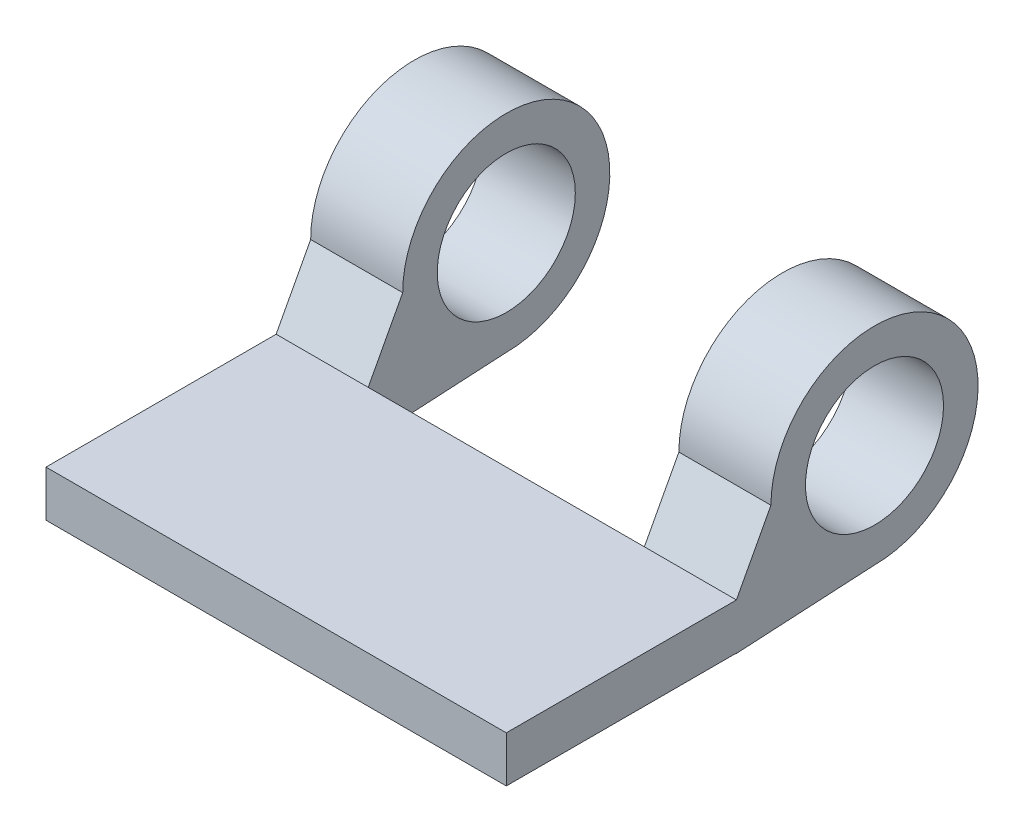
ISO-10303-21;
HEADER;
FILE_DESCRIPTION(('STEP AP214'),'2;1');
FILE_NAME('part.step','',(''),(''),'','','');
FILE_SCHEMA(('AUTOMOTIVE_DESIGN { 1 0 10303 214 1 1 1 1 }'));
ENDSEC;
DATA;
#1=APPLICATION_CONTEXT('core data for automotive mechanical design processes');
#2=APPLICATION_PROTOCOL_DEFINITION('international standard','automotive_design',2000,#1);
#3=PRODUCT_CONTEXT('',#1,'mechanical');
#4=PRODUCT('Part','Part','',(#3));
#5=PRODUCT_RELATED_PRODUCT_CATEGORY('part','',(#4));
#6=PRODUCT_DEFINITION_FORMATION('','',#4);
#7=PRODUCT_DEFINITION_CONTEXT('part definition',#1,'design');
#8=PRODUCT_DEFINITION('design','',#6,#7);
#9=PRODUCT_DEFINITION_SHAPE('','',#8);
#10=(LENGTH_UNIT() NAMED_UNIT(*) SI_UNIT(.MILLI.,.METRE.));
#11=(NAMED_UNIT(*) PLANE_ANGLE_UNIT() SI_UNIT($,.RADIAN.));
#12=(NAMED_UNIT(*) SI_UNIT($,.STERADIAN.) SOLID_ANGLE_UNIT());
#13=UNCERTAINTY_MEASURE_WITH_UNIT(LENGTH_MEASURE(1.E-05),#10,'distance_accuracy_value','');
#14=(GEOMETRIC_REPRESENTATION_CONTEXT(3) GLOBAL_UNCERTAINTY_ASSIGNED_CONTEXT((#13)) GLOBAL_UNIT_ASSIGNED_CONTEXT((#10,
#11,#12)) REPRESENTATION_CONTEXT('',''));
#15=CARTESIAN_POINT('',(0.,0.,0.));
#16=DIRECTION('',(0.,0.,1.));
#17=DIRECTION('',(1.,0.,0.));
#18=AXIS2_PLACEMENT_3D('',#15,#16,#17);
#19=CARTESIAN_POINT('',(0.,2.,0.));
#20=DIRECTION('',(0.,0.,-1.));
#21=DIRECTION('',(-1.,0.,0.));
#22=AXIS2_PLACEMENT_3D('',#19,#20,#21);
#23=PLANE('',#22);
#24=DIRECTION('',(1.,0.,0.));
#25=VECTOR('',#24,1.);
#26=CARTESIAN_POINT('',(0.,0.,0.));
#27=LINE('',#26,#25);
#28=CARTESIAN_POINT('',(-6.,0.,0.));
#29=VERTEX_POINT('',#28);
#30=CARTESIAN_POINT('',(6.,0.,0.));
#31=VERTEX_POINT('',#30);
#32=EDGE_CURVE('E71',#29,#31,#27,.T.);
#33=ORIENTED_EDGE('',*,*,#32,.F.);
#34=DIRECTION('',(0.,-1.,0.));
#35=VECTOR('',#34,1.);
#36=CARTESIAN_POINT('',(-6.,2.,0.));
#37=LINE('',#36,#35);
#38=CARTESIAN_POINT('',(-6.,2.,0.));
#39=VERTEX_POINT('',#38);
#40=EDGE_CURVE('E63',#39,#29,#37,.T.);
#41=ORIENTED_EDGE('',*,*,#40,.F.);
#42=DIRECTION('',(1.,0.,0.));
#43=VECTOR('',#42,1.);
#44=CARTESIAN_POINT('',(0.,2.,0.));
#45=LINE('',#44,#43);
#46=CARTESIAN_POINT('',(6.,2.,0.));
#47=VERTEX_POINT('',#46);
#48=EDGE_CURVE('E166',#39,#47,#45,.T.);
#49=ORIENTED_EDGE('',*,*,#48,.T.);
#50=DIRECTION('',(0.,-1.,0.));
#51=VECTOR('',#50,1.);
#52=CARTESIAN_POINT('',(6.,2.,0.));
#53=LINE('',#52,#51);
#54=EDGE_CURVE('E243',#47,#31,#53,.T.);
#55=ORIENTED_EDGE('',*,*,#54,.T.);
#56=EDGE_LOOP('',(#33,#41,#49,#55));
#57=FACE_BOUND('',#56,.T.);
#58=ADVANCED_FACE('F47',(#57),#23,.T.);
#59=CARTESIAN_POINT('',(10.,2.,0.));
#60=DIRECTION('',(1.,0.,0.));
#61=DIRECTION('',(0.,0.,-1.));
#62=AXIS2_PLACEMENT_3D('',#59,#60,#61);
#63=PLANE('',#62);
#64=DIRECTION('',(0.,0.,1.));
#65=VECTOR('',#64,1.);
#66=CARTESIAN_POINT('',(10.,0.,0.));
#67=LINE('',#66,#65);
#68=CARTESIAN_POINT('',(10.,0.,0.));
#69=VERTEX_POINT('',#68);
#70=CARTESIAN_POINT('',(10.,0.,10.));
#71=VERTEX_POINT('',#70);
#72=EDGE_CURVE('E176',#69,#71,#67,.T.);
#73=ORIENTED_EDGE('',*,*,#72,.F.);
#74=DIRECTION('',(0.,-1.,0.));
#75=VECTOR('',#74,1.);
#76=CARTESIAN_POINT('',(10.,2.,0.));
#77=LINE('',#76,#75);
#78=CARTESIAN_POINT('',(10.,-0.0140422264021949,0.));
#79=VERTEX_POINT('',#78);
#80=EDGE_CURVE('E230',#69,#79,#77,.T.);
#81=ORIENTED_EDGE('',*,*,#80,.T.);
#82=DIRECTION('',(0.,0.0546560342685006,-0.998505241807994));
#83=VECTOR('',#82,1.);
#84=CARTESIAN_POINT('',(10.,0.314384898344003,-6.00000000000005));
#85=LINE('',#84,#83);
#86=CARTESIAN_POINT('',(10.,0.314384898344003,-6.00000000000005));
#87=VERTEX_POINT('',#86);
#88=EDGE_CURVE('E227',#79,#87,#85,.T.);
#89=ORIENTED_EDGE('',*,*,#88,.T.);
#90=CARTESIAN_POINT('',(10.,4.814384898344,-6.));
#91=DIRECTION('',(1.,0.,0.));
#92=DIRECTION('',(0.,0.,-1.));
#93=AXIS2_PLACEMENT_3D('',#90,#91,#92);
#94=CIRCLE('',#93,4.49999999999999);
#95=CARTESIAN_POINT('',(10.,4.814384898344,-1.5));
#96=VERTEX_POINT('',#95);
#97=EDGE_CURVE('E224',#87,#96,#94,.T.);
#98=ORIENTED_EDGE('',*,*,#97,.T.);
#99=DIRECTION('',(0.,-0.882483793082707,0.470342805777188));
#100=VECTOR('',#99,1.);
#101=CARTESIAN_POINT('',(10.,2.,0.));
#102=LINE('',#101,#100);
#103=CARTESIAN_POINT('',(10.,2.,0.));
#104=VERTEX_POINT('',#103);
#105=EDGE_CURVE('E221',#96,#104,#102,.T.);
#106=ORIENTED_EDGE('',*,*,#105,.T.);
#107=DIRECTION('',(0.,0.,1.));
#108=VECTOR('',#107,1.);
#109=CARTESIAN_POINT('',(10.,2.,0.));
#110=LINE('',#109,#108);
#111=CARTESIAN_POINT('',(10.,2.,10.));
#112=VERTEX_POINT('',#111);
#113=EDGE_CURVE('E170',#104,#112,#110,.T.);
#114=ORIENTED_EDGE('',*,*,#113,.T.);
#115=DIRECTION('',(0.,-1.,0.));
#116=VECTOR('',#115,1.);
#117=CARTESIAN_POINT('',(10.,2.,10.));
#118=LINE('',#117,#116);
#119=EDGE_CURVE('E56',#112,#71,#118,.T.);
#120=ORIENTED_EDGE('',*,*,#119,.T.);
#121=EDGE_LOOP('',(#73,#81,#89,#98,#106,#114,#120));
#122=FACE_BOUND('',#121,.T.);
#123=CARTESIAN_POINT('',(10.,4.814384898344,-6.));
#124=DIRECTION('',(1.,0.,0.));
#125=DIRECTION('',(0.,0.,-1.));
#126=AXIS2_PLACEMENT_3D('',#123,#124,#125);
#127=CIRCLE('',#126,2.99999999999999);
#128=CARTESIAN_POINT('',(10.,4.814384898344,-8.99999999999999));
#129=VERTEX_POINT('',#128);
#130=EDGE_CURVE('E249',#129,#129,#127,.T.);
#131=ORIENTED_EDGE('',*,*,#130,.F.);
#132=EDGE_LOOP('',(#131));
#133=FACE_BOUND('',#132,.T.);
#134=ADVANCED_FACE('F49',(#122,#133),#63,.T.);
#135=CARTESIAN_POINT('',(-10.,2.,0.));
#136=DIRECTION('',(1.,0.,0.));
#137=DIRECTION('',(0.,0.,-1.));
#138=AXIS2_PLACEMENT_3D('',#135,#136,#137);
#139=PLANE('',#138);
#140=DIRECTION('',(0.,0.,1.));
#141=VECTOR('',#140,1.);
#142=CARTESIAN_POINT('',(-10.,0.,0.));
#143=LINE('',#142,#141);
#144=CARTESIAN_POINT('',(-10.,0.,0.));
#145=VERTEX_POINT('',#144);
#146=CARTESIAN_POINT('',(-10.,0.,10.));
#147=VERTEX_POINT('',#146);
#148=EDGE_CURVE('E185',#145,#147,#143,.T.);
#149=ORIENTED_EDGE('',*,*,#148,.T.);
#150=DIRECTION('',(0.,-1.,0.));
#151=VECTOR('',#150,1.);
#152=CARTESIAN_POINT('',(-10.,2.,10.));
#153=LINE('',#152,#151);
#154=CARTESIAN_POINT('',(-10.,2.,10.));
#155=VERTEX_POINT('',#154);
#156=EDGE_CURVE('E11',#155,#147,#153,.T.);
#157=ORIENTED_EDGE('',*,*,#156,.F.);
#158=DIRECTION('',(0.,0.,1.));
#159=VECTOR('',#158,1.);
#160=CARTESIAN_POINT('',(-10.,2.,0.));
#161=LINE('',#160,#159);
#162=CARTESIAN_POINT('',(-10.,2.,0.));
#163=VERTEX_POINT('',#162);
#164=EDGE_CURVE('E154',#163,#155,#161,.T.);
#165=ORIENTED_EDGE('',*,*,#164,.F.);
#166=DIRECTION('',(0.,-0.882483793082707,0.470342805777188));
#167=VECTOR('',#166,1.);
#168=CARTESIAN_POINT('',(-10.,2.,0.));
#169=LINE('',#168,#167);
#170=CARTESIAN_POINT('',(-10.,4.814384898344,-1.5));
#171=VERTEX_POINT('',#170);
#172=EDGE_CURVE('E139',#171,#163,#169,.T.);
#173=ORIENTED_EDGE('',*,*,#172,.F.);
#174=CARTESIAN_POINT('',(-10.,4.814384898344,-6.));
#175=DIRECTION('',(1.,0.,0.));
#176=DIRECTION('',(0.,0.,-1.));
#177=AXIS2_PLACEMENT_3D('',#174,#175,#176);
#178=CIRCLE('',#177,4.49999999999999);
#179=CARTESIAN_POINT('',(-10.,0.314384898344003,-6.00000000000005));
#180=VERTEX_POINT('',#179);
#181=EDGE_CURVE('E150',#180,#171,#178,.T.);
#182=ORIENTED_EDGE('',*,*,#181,.F.);
#183=DIRECTION('',(0.,0.0546560342685006,-0.998505241807994));
#184=VECTOR('',#183,1.);
#185=CARTESIAN_POINT('',(-10.,0.314384898344003,-6.00000000000005));
#186=LINE('',#185,#184);
#187=CARTESIAN_POINT('',(-10.,-0.0140422264021949,0.));
#188=VERTEX_POINT('',#187);
#189=EDGE_CURVE('E265',#188,#180,#186,.T.);
#190=ORIENTED_EDGE('',*,*,#189,.F.);
#191=DIRECTION('',(0.,-1.,0.));
#192=VECTOR('',#191,1.);
#193=CARTESIAN_POINT('',(-10.,2.,0.));
#194=LINE('',#193,#192);
#195=EDGE_CURVE('E151',#145,#188,#194,.T.);
#196=ORIENTED_EDGE('',*,*,#195,.F.);
#197=EDGE_LOOP('',(#149,#157,#165,#173,#182,#190,#196));
#198=FACE_BOUND('',#197,.T.);
#199=CARTESIAN_POINT('',(-10.,4.814384898344,-6.));
#200=DIRECTION('',(1.,0.,0.));
#201=DIRECTION('',(0.,0.,-1.));
#202=AXIS2_PLACEMENT_3D('',#199,#200,#201);
#203=CIRCLE('',#202,2.99999999999999);
#204=CARTESIAN_POINT('',(-10.,4.814384898344,-8.99999999999999));
#205=VERTEX_POINT('',#204);
#206=EDGE_CURVE('E289',#205,#205,#203,.T.);
#207=ORIENTED_EDGE('',*,*,#206,.T.);
#208=EDGE_LOOP('',(#207));
#209=FACE_BOUND('',#208,.T.);
#210=ADVANCED_FACE('F155',(#198,#209),#139,.F.);
#211=CARTESIAN_POINT('',(0.,2.,10.));
#212=DIRECTION('',(0.,0.,-1.));
#213=DIRECTION('',(-1.,0.,0.));
#214=AXIS2_PLACEMENT_3D('',#211,#212,#213);
#215=PLANE('',#214);
#216=DIRECTION('',(1.,0.,0.));
#217=VECTOR('',#216,1.);
#218=CARTESIAN_POINT('',(0.,0.,10.));
#219=LINE('',#218,#217);
#220=EDGE_CURVE('E188',#147,#71,#219,.T.);
#221=ORIENTED_EDGE('',*,*,#220,.T.);
#222=ORIENTED_EDGE('',*,*,#119,.F.);
#223=DIRECTION('',(1.,0.,0.));
#224=VECTOR('',#223,1.);
#225=CARTESIAN_POINT('',(0.,2.,10.));
#226=LINE('',#225,#224);
#227=EDGE_CURVE('E160',#155,#112,#226,.T.);
#228=ORIENTED_EDGE('',*,*,#227,.F.);
#229=ORIENTED_EDGE('',*,*,#156,.T.);
#230=EDGE_LOOP('',(#221,#222,#228,#229));
#231=FACE_BOUND('',#230,.T.);
#232=ADVANCED_FACE('F199',(#231),#215,.F.);
#233=CARTESIAN_POINT('',(0.,2.,0.));
#234=DIRECTION('',(0.,1.,0.));
#235=DIRECTION('',(0.,0.,1.));
#236=AXIS2_PLACEMENT_3D('',#233,#234,#235);
#237=PLANE('',#236);
#238=ORIENTED_EDGE('',*,*,#113,.F.);
#239=DIRECTION('',(-1.,0.,0.));
#240=VECTOR('',#239,1.);
#241=CARTESIAN_POINT('',(10.,2.,0.));
#242=LINE('',#241,#240);
#243=EDGE_CURVE('E218',#104,#47,#242,.T.);
#244=ORIENTED_EDGE('',*,*,#243,.T.);
#245=ORIENTED_EDGE('',*,*,#48,.F.);
#246=EDGE_CURVE('E144',#163,#39,#45,.T.);
#247=ORIENTED_EDGE('',*,*,#246,.F.);
#248=ORIENTED_EDGE('',*,*,#164,.T.);
#249=ORIENTED_EDGE('',*,*,#227,.T.);
#250=EDGE_LOOP('',(#238,#244,#245,#247,#248,#249));
#251=FACE_BOUND('',#250,.T.);
#252=ADVANCED_FACE('F164',(#251),#237,.T.);
#253=CARTESIAN_POINT('',(0.,0.,0.));
#254=DIRECTION('',(0.,1.,0.));
#255=DIRECTION('',(0.,0.,1.));
#256=AXIS2_PLACEMENT_3D('',#253,#254,#255);
#257=PLANE('',#256);
#258=ORIENTED_EDGE('',*,*,#72,.T.);
#259=ORIENTED_EDGE('',*,*,#220,.F.);
#260=ORIENTED_EDGE('',*,*,#148,.F.);
#261=EDGE_CURVE('E182',#145,#29,#27,.T.);
#262=ORIENTED_EDGE('',*,*,#261,.T.);
#263=ORIENTED_EDGE('',*,*,#32,.T.);
#264=EDGE_CURVE('E180',#31,#69,#27,.T.);
#265=ORIENTED_EDGE('',*,*,#264,.T.);
#266=EDGE_LOOP('',(#258,#259,#260,#262,#263,#265));
#267=FACE_BOUND('',#266,.T.);
#268=ADVANCED_FACE('F201',(#267),#257,.F.);
#269=CARTESIAN_POINT('',(6.,4.814384898344,-6.));
#270=DIRECTION('',(1.,0.,0.));
#271=DIRECTION('',(0.,0.,-1.));
#272=AXIS2_PLACEMENT_3D('',#269,#270,#271);
#273=PLANE('',#272);
#274=ORIENTED_EDGE('',*,*,#54,.F.);
#275=DIRECTION('',(0.,-0.882483793082707,0.470342805777188));
#276=VECTOR('',#275,1.);
#277=CARTESIAN_POINT('',(6.,2.,0.));
#278=LINE('',#277,#276);
#279=CARTESIAN_POINT('',(6.,4.814384898344,-1.5));
#280=VERTEX_POINT('',#279);
#281=EDGE_CURVE('E233',#280,#47,#278,.T.);
#282=ORIENTED_EDGE('',*,*,#281,.F.);
#283=CARTESIAN_POINT('',(6.,4.814384898344,-6.));
#284=DIRECTION('',(1.,0.,0.));
#285=DIRECTION('',(0.,0.,-1.));
#286=AXIS2_PLACEMENT_3D('',#283,#284,#285);
#287=CIRCLE('',#286,4.49999999999999);
#288=CARTESIAN_POINT('',(6.,0.314384898344003,-6.00000000000005));
#289=VERTEX_POINT('',#288);
#290=EDGE_CURVE('E237',#289,#280,#287,.T.);
#291=ORIENTED_EDGE('',*,*,#290,.F.);
#292=DIRECTION('',(0.,0.0546560342685006,-0.998505241807994));
#293=VECTOR('',#292,1.);
#294=CARTESIAN_POINT('',(6.,0.314384898344003,-6.00000000000005));
#295=LINE('',#294,#293);
#296=CARTESIAN_POINT('',(6.,-0.0140422264021949,0.));
#297=VERTEX_POINT('',#296);
#298=EDGE_CURVE('E240',#297,#289,#295,.T.);
#299=ORIENTED_EDGE('',*,*,#298,.F.);
#300=EDGE_CURVE('E246',#31,#297,#53,.T.);
#301=ORIENTED_EDGE('',*,*,#300,.F.);
#302=EDGE_LOOP('',(#274,#282,#291,#299,#301));
#303=FACE_BOUND('',#302,.T.);
#304=CARTESIAN_POINT('',(6.,4.814384898344,-6.));
#305=DIRECTION('',(1.,0.,0.));
#306=DIRECTION('',(0.,0.,-1.));
#307=AXIS2_PLACEMENT_3D('',#304,#305,#306);
#308=CIRCLE('',#307,2.99999999999999);
#309=CARTESIAN_POINT('',(6.,4.814384898344,-8.99999999999999));
#310=VERTEX_POINT('',#309);
#311=EDGE_CURVE('E252',#310,#310,#308,.T.);
#312=ORIENTED_EDGE('',*,*,#311,.T.);
#313=EDGE_LOOP('',(#312));
#314=FACE_BOUND('',#313,.T.);
#315=ADVANCED_FACE('F326',(#303,#314),#273,.F.);
#316=CARTESIAN_POINT('',(10.,2.,0.));
#317=DIRECTION('',(0.,0.,-1.));
#318=DIRECTION('',(0.,1.,0.));
#319=AXIS2_PLACEMENT_3D('',#316,#317,#318);
#320=PLANE('',#319);
#321=ORIENTED_EDGE('',*,*,#264,.F.);
#322=ORIENTED_EDGE('',*,*,#300,.T.);
#323=DIRECTION('',(-1.,0.,0.));
#324=VECTOR('',#323,1.);
#325=CARTESIAN_POINT('',(10.,-0.0140422264021949,0.));
#326=LINE('',#325,#324);
#327=EDGE_CURVE('E181',#79,#297,#326,.T.);
#328=ORIENTED_EDGE('',*,*,#327,.F.);
#329=ORIENTED_EDGE('',*,*,#80,.F.);
#330=EDGE_LOOP('',(#321,#322,#328,#329));
#331=FACE_BOUND('',#330,.T.);
#332=ADVANCED_FACE('F329',(#331),#320,.F.);
#333=CARTESIAN_POINT('',(10.,0.314384898344003,-6.00000000000005));
#334=DIRECTION('',(0.,0.998505241807994,0.0546560342685006));
#335=DIRECTION('',(0.,-0.0546560342685006,0.998505241807994));
#336=AXIS2_PLACEMENT_3D('',#333,#334,#335);
#337=PLANE('',#336);
#338=ORIENTED_EDGE('',*,*,#298,.T.);
#339=DIRECTION('',(-1.,0.,0.));
#340=VECTOR('',#339,1.);
#341=CARTESIAN_POINT('',(10.,0.314384898344003,-6.00000000000005));
#342=LINE('',#341,#340);
#343=EDGE_CURVE('E211',#87,#289,#342,.T.);
#344=ORIENTED_EDGE('',*,*,#343,.F.);
#345=ORIENTED_EDGE('',*,*,#88,.F.);
#346=ORIENTED_EDGE('',*,*,#327,.T.);
#347=EDGE_LOOP('',(#338,#344,#345,#346));
#348=FACE_BOUND('',#347,.T.);
#349=ADVANCED_FACE('F332',(#348),#337,.F.);
#350=CARTESIAN_POINT('',(10.,4.814384898344,-6.));
#351=DIRECTION('',(-1.,0.,0.));
#352=DIRECTION('',(0.,0.,1.));
#353=AXIS2_PLACEMENT_3D('',#350,#351,#352);
#354=CYLINDRICAL_SURFACE('',#353,4.49999999999999);
#355=ORIENTED_EDGE('',*,*,#290,.T.);
#356=DIRECTION('',(-1.,0.,0.));
#357=VECTOR('',#356,1.);
#358=CARTESIAN_POINT('',(10.,4.814384898344,-1.5));
#359=LINE('',#358,#357);
#360=EDGE_CURVE('E214',#96,#280,#359,.T.);
#361=ORIENTED_EDGE('',*,*,#360,.F.);
#362=ORIENTED_EDGE('',*,*,#97,.F.);
#363=ORIENTED_EDGE('',*,*,#343,.T.);
#364=EDGE_LOOP('',(#355,#361,#362,#363));
#365=FACE_BOUND('',#364,.T.);
#366=ADVANCED_FACE('F335',(#365),#354,.T.);
#367=CARTESIAN_POINT('',(10.,2.,0.));
#368=DIRECTION('',(0.,-0.470342805777188,-0.882483793082707));
#369=DIRECTION('',(0.,0.882483793082707,-0.470342805777188));
#370=AXIS2_PLACEMENT_3D('',#367,#368,#369);
#371=PLANE('',#370);
#372=ORIENTED_EDGE('',*,*,#281,.T.);
#373=ORIENTED_EDGE('',*,*,#243,.F.);
#374=ORIENTED_EDGE('',*,*,#105,.F.);
#375=ORIENTED_EDGE('',*,*,#360,.T.);
#376=EDGE_LOOP('',(#372,#373,#374,#375));
#377=FACE_BOUND('',#376,.T.);
#378=ADVANCED_FACE('F339',(#377),#371,.F.);
#379=CARTESIAN_POINT('',(10.,4.814384898344,-6.));
#380=DIRECTION('',(-1.,0.,0.));
#381=DIRECTION('',(0.,0.,1.));
#382=AXIS2_PLACEMENT_3D('',#379,#380,#381);
#383=CYLINDRICAL_SURFACE('',#382,2.99999999999999);
#384=ORIENTED_EDGE('',*,*,#130,.T.);
#385=EDGE_LOOP('',(#384));
#386=FACE_BOUND('',#385,.T.);
#387=ORIENTED_EDGE('',*,*,#311,.F.);
#388=EDGE_LOOP('',(#387));
#389=FACE_BOUND('',#388,.T.);
#390=ADVANCED_FACE('F343',(#386,#389),#383,.F.);
#391=CARTESIAN_POINT('',(-10.,2.,0.));
#392=DIRECTION('',(0.,0.,1.));
#393=DIRECTION('',(0.,-1.,0.));
#394=AXIS2_PLACEMENT_3D('',#391,#392,#393);
#395=PLANE('',#394);
#396=ORIENTED_EDGE('',*,*,#261,.F.);
#397=ORIENTED_EDGE('',*,*,#195,.T.);
#398=DIRECTION('',(1.,0.,0.));
#399=VECTOR('',#398,1.);
#400=CARTESIAN_POINT('',(-10.,-0.0140422264021949,0.));
#401=LINE('',#400,#399);
#402=CARTESIAN_POINT('',(-6.,-0.0140422264021949,0.));
#403=VERTEX_POINT('',#402);
#404=EDGE_CURVE('E261',#188,#403,#401,.T.);
#405=ORIENTED_EDGE('',*,*,#404,.T.);
#406=EDGE_CURVE('E286',#29,#403,#37,.T.);
#407=ORIENTED_EDGE('',*,*,#406,.F.);
#408=EDGE_LOOP('',(#396,#397,#405,#407));
#409=FACE_BOUND('',#408,.T.);
#410=ADVANCED_FACE('F349',(#409),#395,.T.);
#411=CARTESIAN_POINT('',(-10.,2.,0.));
#412=DIRECTION('',(0.,0.470342805777188,0.882483793082707));
#413=DIRECTION('',(0.,-0.882483793082707,0.470342805777188));
#414=AXIS2_PLACEMENT_3D('',#411,#412,#413);
#415=PLANE('',#414);
#416=DIRECTION('',(0.,-0.882483793082707,0.470342805777188));
#417=VECTOR('',#416,1.);
#418=CARTESIAN_POINT('',(-6.,2.,0.));
#419=LINE('',#418,#417);
#420=CARTESIAN_POINT('',(-6.,4.814384898344,-1.5));
#421=VERTEX_POINT('',#420);
#422=EDGE_CURVE('E281',#421,#39,#419,.T.);
#423=ORIENTED_EDGE('',*,*,#422,.F.);
#424=DIRECTION('',(1.,0.,0.));
#425=VECTOR('',#424,1.);
#426=CARTESIAN_POINT('',(-10.,4.814384898344,-1.5));
#427=LINE('',#426,#425);
#428=EDGE_CURVE('E145',#171,#421,#427,.T.);
#429=ORIENTED_EDGE('',*,*,#428,.F.);
#430=ORIENTED_EDGE('',*,*,#172,.T.);
#431=ORIENTED_EDGE('',*,*,#246,.T.);
#432=EDGE_LOOP('',(#423,#429,#430,#431));
#433=FACE_BOUND('',#432,.T.);
#434=ADVANCED_FACE('F142',(#433),#415,.T.);
#435=CARTESIAN_POINT('',(-10.,4.814384898344,-6.));
#436=DIRECTION('',(1.,0.,0.));
#437=DIRECTION('',(0.,0.,-1.));
#438=AXIS2_PLACEMENT_3D('',#435,#436,#437);
#439=CYLINDRICAL_SURFACE('',#438,4.49999999999999);
#440=CARTESIAN_POINT('',(-6.,4.814384898344,-6.));
#441=DIRECTION('',(1.,0.,0.));
#442=DIRECTION('',(0.,0.,-1.));
#443=AXIS2_PLACEMENT_3D('',#440,#441,#442);
#444=CIRCLE('',#443,4.49999999999999);
#445=CARTESIAN_POINT('',(-6.,0.314384898344003,-6.00000000000005));
#446=VERTEX_POINT('',#445);
#447=EDGE_CURVE('E277',#446,#421,#444,.T.);
#448=ORIENTED_EDGE('',*,*,#447,.F.);
#449=DIRECTION('',(1.,0.,0.));
#450=VECTOR('',#449,1.);
#451=CARTESIAN_POINT('',(-10.,0.314384898344003,-6.00000000000005));
#452=LINE('',#451,#450);
#453=EDGE_CURVE('E258',#180,#446,#452,.T.);
#454=ORIENTED_EDGE('',*,*,#453,.F.);
#455=ORIENTED_EDGE('',*,*,#181,.T.);
#456=ORIENTED_EDGE('',*,*,#428,.T.);
#457=EDGE_LOOP('',(#448,#454,#455,#456));
#458=FACE_BOUND('',#457,.T.);
#459=ADVANCED_FACE('F310',(#458),#439,.T.);
#460=CARTESIAN_POINT('',(-10.,0.314384898344003,-6.00000000000005));
#461=DIRECTION('',(0.,-0.998505241807994,-0.0546560342685006));
#462=DIRECTION('',(0.,0.0546560342685006,-0.998505241807994));
#463=AXIS2_PLACEMENT_3D('',#460,#461,#462);
#464=PLANE('',#463);
#465=DIRECTION('',(0.,0.0546560342685006,-0.998505241807994));
#466=VECTOR('',#465,1.);
#467=CARTESIAN_POINT('',(-6.,0.314384898344003,-6.00000000000005));
#468=LINE('',#467,#466);
#469=EDGE_CURVE('E273',#403,#446,#468,.T.);
#470=ORIENTED_EDGE('',*,*,#469,.F.);
#471=ORIENTED_EDGE('',*,*,#404,.F.);
#472=ORIENTED_EDGE('',*,*,#189,.T.);
#473=ORIENTED_EDGE('',*,*,#453,.T.);
#474=EDGE_LOOP('',(#470,#471,#472,#473));
#475=FACE_BOUND('',#474,.T.);
#476=ADVANCED_FACE('F302',(#475),#464,.T.);
#477=CARTESIAN_POINT('',(-6.,4.814384898344,-6.));
#478=DIRECTION('',(-1.,0.,0.));
#479=DIRECTION('',(0.,0.,-1.));
#480=AXIS2_PLACEMENT_3D('',#477,#478,#479);
#481=PLANE('',#480);
#482=CARTESIAN_POINT('',(-6.,4.814384898344,-6.));
#483=DIRECTION('',(1.,0.,0.));
#484=DIRECTION('',(0.,0.,-1.));
#485=AXIS2_PLACEMENT_3D('',#482,#483,#484);
#486=CIRCLE('',#485,2.99999999999999);
#487=CARTESIAN_POINT('',(-6.,4.814384898344,-8.99999999999999));
#488=VERTEX_POINT('',#487);
#489=EDGE_CURVE('E292',#488,#488,#486,.T.);
#490=ORIENTED_EDGE('',*,*,#489,.F.);
#491=EDGE_LOOP('',(#490));
#492=FACE_BOUND('',#491,.T.);
#493=ORIENTED_EDGE('',*,*,#40,.T.);
#494=ORIENTED_EDGE('',*,*,#406,.T.);
#495=ORIENTED_EDGE('',*,*,#469,.T.);
#496=ORIENTED_EDGE('',*,*,#447,.T.);
#497=ORIENTED_EDGE('',*,*,#422,.T.);
#498=EDGE_LOOP('',(#493,#494,#495,#496,#497));
#499=FACE_BOUND('',#498,.T.);
#500=ADVANCED_FACE('F300',(#492,#499),#481,.F.);
#501=CARTESIAN_POINT('',(-10.,4.814384898344,-6.));
#502=DIRECTION('',(1.,0.,0.));
#503=DIRECTION('',(0.,0.,-1.));
#504=AXIS2_PLACEMENT_3D('',#501,#502,#503);
#505=CYLINDRICAL_SURFACE('',#504,2.99999999999999);
#506=ORIENTED_EDGE('',*,*,#206,.F.);
#507=EDGE_LOOP('',(#506));
#508=FACE_BOUND('',#507,.T.);
#509=ORIENTED_EDGE('',*,*,#489,.T.);
#510=EDGE_LOOP('',(#509));
#511=FACE_BOUND('',#510,.T.);
#512=ADVANCED_FACE('F298',(#508,#511),#505,.F.);
#513=CLOSED_SHELL('',(#58,#134,#210,#232,#252,#268,#315,#332,#349,#366,#378,#390,#410,#434,#459,
#476,#500,#512));
#514=MANIFOLD_SOLID_BREP('B2',#513);
#515=ADVANCED_BREP_SHAPE_REPRESENTATION('',(#18,#514),#14);
#516=SHAPE_DEFINITION_REPRESENTATION(#9,#515);
ENDSEC;
END-ISO-10303-21;
